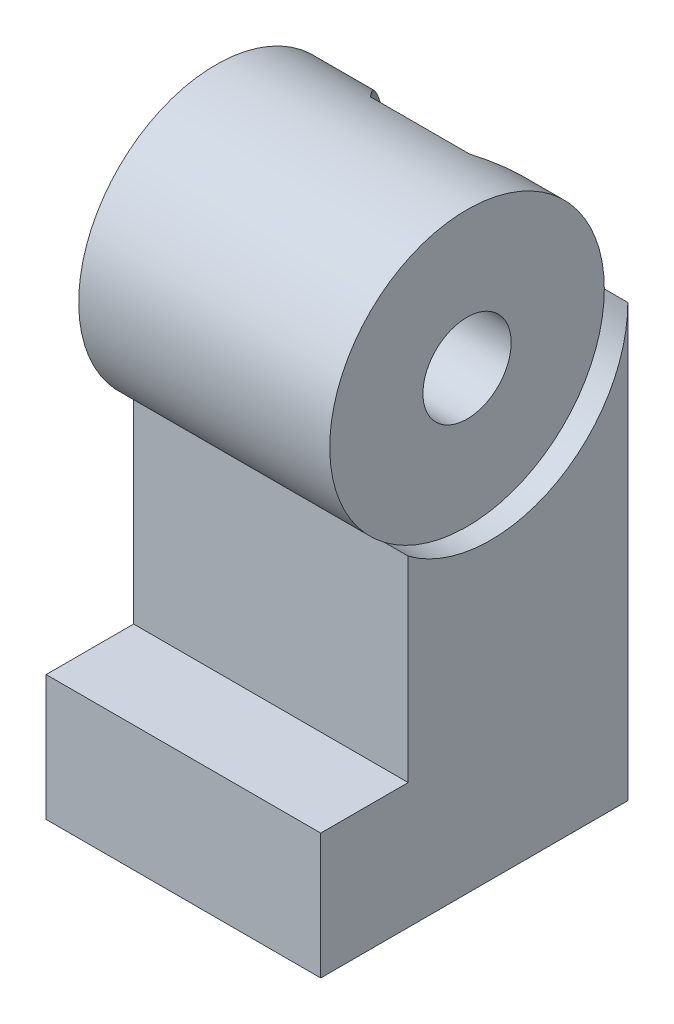
ISO-10303-21;
HEADER;
FILE_DESCRIPTION(('STEP AP214'),'2;1');
FILE_NAME('part.step','',(''),(''),'','','');
FILE_SCHEMA(('AUTOMOTIVE_DESIGN { 1 0 10303 214 1 1 1 1 }'));
ENDSEC;
DATA;
#1=APPLICATION_CONTEXT('core data for automotive mechanical design processes');
#2=APPLICATION_PROTOCOL_DEFINITION('international standard','automotive_design',2000,#1);
#3=PRODUCT_CONTEXT('',#1,'mechanical');
#4=PRODUCT('Part','Part','',(#3));
#5=PRODUCT_RELATED_PRODUCT_CATEGORY('part','',(#4));
#6=PRODUCT_DEFINITION_FORMATION('','',#4);
#7=PRODUCT_DEFINITION_CONTEXT('part definition',#1,'design');
#8=PRODUCT_DEFINITION('design','',#6,#7);
#9=PRODUCT_DEFINITION_SHAPE('','',#8);
#10=(LENGTH_UNIT() NAMED_UNIT(*) SI_UNIT(.MILLI.,.METRE.));
#11=(NAMED_UNIT(*) PLANE_ANGLE_UNIT() SI_UNIT($,.RADIAN.));
#12=(NAMED_UNIT(*) SI_UNIT($,.STERADIAN.) SOLID_ANGLE_UNIT());
#13=UNCERTAINTY_MEASURE_WITH_UNIT(LENGTH_MEASURE(1.E-05),#10,'distance_accuracy_value','');
#14=(GEOMETRIC_REPRESENTATION_CONTEXT(3) GLOBAL_UNCERTAINTY_ASSIGNED_CONTEXT((#13)) GLOBAL_UNIT_ASSIGNED_CONTEXT((#10,
#11,#12)) REPRESENTATION_CONTEXT('',''));
#15=CARTESIAN_POINT('',(0.,0.,0.));
#16=DIRECTION('',(0.,0.,1.));
#17=DIRECTION('',(1.,0.,0.));
#18=AXIS2_PLACEMENT_3D('',#15,#16,#17);
#19=CARTESIAN_POINT('',(3.5,11.9,-6.03));
#20=DIRECTION('',(0.,0.,-1.));
#21=DIRECTION('',(-1.,0.,0.));
#22=AXIS2_PLACEMENT_3D('',#19,#20,#21);
#23=PLANE('',#22);
#24=DIRECTION('',(0.,1.,0.));
#25=VECTOR('',#24,1.);
#26=CARTESIAN_POINT('',(1.34039768722099,13.1594117081557,-6.03));
#27=LINE('',#26,#25);
#28=CARTESIAN_POINT('',(1.34039768722099,10.6405882918443,-6.03));
#29=VERTEX_POINT('',#28);
#30=CARTESIAN_POINT('',(1.34039768722099,13.1594117081557,-6.03));
#31=VERTEX_POINT('',#30);
#32=EDGE_CURVE('E195',#29,#31,#27,.T.);
#33=ORIENTED_EDGE('',*,*,#32,.F.);
#34=CARTESIAN_POINT('',(3.5,11.9,-6.03));
#35=DIRECTION('',(0.,0.,-1.));
#36=DIRECTION('',(-1.,0.,0.));
#37=AXIS2_PLACEMENT_3D('',#34,#35,#36);
#38=CIRCLE('',#37,2.5);
#39=EDGE_CURVE('E275',#29,#31,#38,.T.);
#40=ORIENTED_EDGE('',*,*,#39,.T.);
#41=EDGE_LOOP('',(#33,#40));
#42=FACE_BOUND('',#41,.T.);
#43=ADVANCED_FACE('F36',(#42),#23,.T.);
#44=CARTESIAN_POINT('',(7.,11.,-4.33));
#45=DIRECTION('',(-1.,0.,0.));
#46=DIRECTION('',(0.,0.,1.));
#47=AXIS2_PLACEMENT_3D('',#44,#45,#46);
#48=CYLINDRICAL_SURFACE('',#47,3.5);
#49=DIRECTION('',(-1.,0.,0.));
#50=VECTOR('',#49,1.);
#51=CARTESIAN_POINT('',(7.,11.,-7.83));
#52=LINE('',#51,#50);
#53=CARTESIAN_POINT('',(6.4,11.,-7.83));
#54=VERTEX_POINT('',#53);
#55=CARTESIAN_POINT('',(5.83238075793812,11.,-7.83));
#56=VERTEX_POINT('',#55);
#57=EDGE_CURVE('E370',#54,#56,#52,.T.);
#58=ORIENTED_EDGE('',*,*,#57,.T.);
#59=CARTESIAN_POINT('',(5.83238075793812,11.,-7.83));
#60=CARTESIAN_POINT('',(5.85384822010717,11.0556037228795,-7.83001039992839));
#61=CARTESIAN_POINT('',(5.87330863674848,11.1119864470982,-7.82867511545479));
#62=CARTESIAN_POINT('',(5.90812719082589,11.2258673812913,-7.82316690174125));
#63=CARTESIAN_POINT('',(5.9234853733801,11.2833655789899,-7.81899400371236));
#64=CARTESIAN_POINT('',(5.94995662444864,11.398795817994,-7.80768783715019));
#65=CARTESIAN_POINT('',(5.96108707069162,11.4567250630494,-7.80056694421528));
#66=CARTESIAN_POINT('',(5.97918764646106,11.5727648991559,-7.78331566720582));
#67=CARTESIAN_POINT('',(5.98615805377609,11.6308754778378,-7.77318548414569));
#68=CARTESIAN_POINT('',(6.00089164117058,11.8048723986325,-7.73824257253206));
#69=CARTESIAN_POINT('',(6.00248352918532,11.9204521126609,-7.70887479252964));
#70=CARTESIAN_POINT('',(5.99034801857386,12.1471916349346,-7.63878917767626));
#71=CARTESIAN_POINT('',(5.97661375172738,12.2583494384298,-7.59806626030262));
#72=CARTESIAN_POINT('',(5.93513597074101,12.4769175354432,-7.50540527907961));
#73=CARTESIAN_POINT('',(5.90700505648089,12.5841312762403,-7.45318113676706));
#74=CARTESIAN_POINT('',(5.83881285104981,12.7897849945176,-7.34006344052072));
#75=CARTESIAN_POINT('',(5.79874377980076,12.8882191958614,-7.2791642466183));
#76=CARTESIAN_POINT('',(5.68488323176721,13.1254072001919,-7.11620266989741));
#77=CARTESIAN_POINT('',(5.60448659901195,13.2577904960523,-7.00946321174239));
#78=CARTESIAN_POINT('',(5.42670988395008,13.5001573524239,-6.78492408509301));
#79=CARTESIAN_POINT('',(5.32928020162339,13.6100734029028,-6.66709259247695));
#80=CARTESIAN_POINT('',(5.15331491777087,13.7778882147941,-6.46193011620579));
#81=CARTESIAN_POINT('',(5.07809431745316,13.8414219972976,-6.3762723496963));
#82=CARTESIAN_POINT('',(4.96140589793444,13.9289491749926,-6.24675438405102));
#83=CARTESIAN_POINT('',(4.92201122887144,13.9567455338021,-6.20356263672901));
#84=CARTESIAN_POINT('',(4.84187906683864,14.0098970517849,-6.11692589064731));
#85=CARTESIAN_POINT('',(4.80114161717354,14.0352522895812,-6.07348090009183));
#86=CARTESIAN_POINT('',(4.75973849456156,14.0594117081557,-6.03));
#87=B_SPLINE_CURVE_WITH_KNOTS('',3,(#59,#60,#61,#62,#63,#64,#65,#66,#67,#68,#69,#70,#71,#72,#73,
#74,#75,#76,#77,#78,#79,#80,#81,#82,#83,#84,#85,#86),.UNSPECIFIED.,.F.,.F.,(4,2,2,2,2,2,2,2,2,2,
2,2,2,4),(0.,0.17876319910252,0.357524432010829,0.535542719933676,0.713549119271721,
1.06947602744379,1.42556250378531,1.79177839089952,2.15823346432115,2.71942223368447,
3.28227325770834,3.6732563436139,3.867394978456,4.06152735843827),.UNSPECIFIED.);
#88=CARTESIAN_POINT('',(4.75973849456156,14.0594117081557,-6.03));
#89=VERTEX_POINT('',#88);
#90=EDGE_CURVE('E286',#56,#89,#87,.T.);
#91=ORIENTED_EDGE('',*,*,#90,.T.);
#92=DIRECTION('',(-1.,0.,0.));
#93=VECTOR('',#92,1.);
#94=CARTESIAN_POINT('',(7.,14.0594117081557,-6.03));
#95=LINE('',#94,#93);
#96=CARTESIAN_POINT('',(2.24026150543844,14.0594117081557,-6.03));
#97=VERTEX_POINT('',#96);
#98=EDGE_CURVE('E44',#97,#89,#95,.F.);
#99=ORIENTED_EDGE('',*,*,#98,.F.);
#100=CARTESIAN_POINT('',(2.24026150543844,14.0594117081557,-6.03));
#101=CARTESIAN_POINT('',(2.17308296360417,14.0201847934842,-6.10060872018845));
#102=CARTESIAN_POINT('',(2.10758615747843,13.9778062067549,-6.17110437893786));
#103=CARTESIAN_POINT('',(1.98009295615254,13.886475673501,-6.31122449351207));
#104=CARTESIAN_POINT('',(1.91810192473916,13.8375140219315,-6.38084749392807));
#105=CARTESIAN_POINT('',(1.79733969422032,13.7323237192715,-6.51907095077589));
#106=CARTESIAN_POINT('',(1.73860827093839,13.6760253638337,-6.58765346961922));
#107=CARTESIAN_POINT('',(1.62567243122048,13.5564001910063,-6.72226296218016));
#108=CARTESIAN_POINT('',(1.57146523558541,13.4930777449861,-6.78829149121666));
#109=CARTESIAN_POINT('',(1.44201995140707,13.3251253424091,-6.9498129946883));
#110=CARTESIAN_POINT('',(1.37008620298902,13.215851810845,-7.0432353067989));
#111=CARTESIAN_POINT('',(1.24187699940769,12.9810490235027,-7.21908778885267));
#112=CARTESIAN_POINT('',(1.18554349112858,12.8555826543195,-7.30155810113673));
#113=CARTESIAN_POINT('',(1.10128695834074,12.6137561391326,-7.43828234742055));
#114=CARTESIAN_POINT('',(1.07005384693101,12.49991962628,-7.49493864656214));
#115=CARTESIAN_POINT('',(1.02369089142462,12.263750084517,-7.59640100657131));
#116=CARTESIAN_POINT('',(1.0085606188956,12.1414172817513,-7.64120738269428));
#117=CARTESIAN_POINT('',(0.99978149854385,11.9537837363267,-7.69818210216271));
#118=CARTESIAN_POINT('',(0.999200548110506,11.8902869949017,-7.71551654467827));
#119=CARTESIAN_POINT('',(1.00296516670746,11.7625652319258,-7.74654781322381));
#120=CARTESIAN_POINT('',(1.00730835614289,11.6983405769829,-7.76024639234143));
#121=CARTESIAN_POINT('',(1.02105833292953,11.5698114935737,-7.78392315250354));
#122=CARTESIAN_POINT('',(1.03046059548942,11.5055071875433,-7.79390464460064));
#123=CARTESIAN_POINT('',(1.05436257244313,11.3774122743731,-7.81019020121197));
#124=CARTESIAN_POINT('',(1.06885938853491,11.3136213962056,-7.8164963512245));
#125=CARTESIAN_POINT('',(1.09727819094867,11.2080053885378,-7.82407239011788));
#126=CARTESIAN_POINT('',(1.10981528005078,11.1658691875481,-7.82631710407692));
#127=CARTESIAN_POINT('',(1.13708253635506,11.0823513081066,-7.82928055361981));
#128=CARTESIAN_POINT('',(1.15180824929459,11.0409682844664,-7.83000234432515));
#129=CARTESIAN_POINT('',(1.16761924206187,11.,-7.83));
#130=B_SPLINE_CURVE_WITH_KNOTS('',3,(#100,#101,#102,#103,#104,#105,#106,#107,#108,#109,#110,
#111,#112,#113,#114,#115,#116,#117,#118,#119,#120,#121,#122,#123,#124,#125,#126,#127,#128,#129),
.UNSPECIFIED.,.F.,.F.,(4,2,2,2,2,2,2,2,2,2,2,2,2,2,4),(0.,0.31515156339305,0.630772938407096,
0.949647664416303,1.26832504380493,1.74888218158112,2.2276262284512,2.61891205471194,
3.01018747015603,3.20741415078802,3.40454556206459,3.60150095306902,3.79834447665022,
3.9303197138308,4.06202994406064),.UNSPECIFIED.);
#131=CARTESIAN_POINT('',(1.16761924206188,11.,-7.83));
#132=VERTEX_POINT('',#131);
#133=EDGE_CURVE('E271',#97,#132,#130,.T.);
#134=ORIENTED_EDGE('',*,*,#133,.T.);
#135=CARTESIAN_POINT('',(0.,11.,-7.83));
#136=VERTEX_POINT('',#135);
#137=EDGE_CURVE('E371',#132,#136,#52,.T.);
#138=ORIENTED_EDGE('',*,*,#137,.T.);
#139=CARTESIAN_POINT('',(0.,11.,-4.33));
#140=DIRECTION('',(1.,0.,0.));
#141=DIRECTION('',(0.,0.,1.));
#142=AXIS2_PLACEMENT_3D('',#139,#140,#141);
#143=CIRCLE('',#142,3.5);
#144=CARTESIAN_POINT('',(0.,8.2,-2.23));
#145=VERTEX_POINT('',#144);
#146=EDGE_CURVE('E388',#136,#145,#143,.T.);
#147=ORIENTED_EDGE('',*,*,#146,.T.);
#148=DIRECTION('',(-1.,0.,0.));
#149=VECTOR('',#148,1.);
#150=CARTESIAN_POINT('',(7.,8.2,-2.23));
#151=LINE('',#150,#149);
#152=CARTESIAN_POINT('',(6.4,8.2,-2.23));
#153=VERTEX_POINT('',#152);
#154=EDGE_CURVE('E375',#153,#145,#151,.T.);
#155=ORIENTED_EDGE('',*,*,#154,.F.);
#156=CARTESIAN_POINT('',(6.4,11.,-4.33));
#157=DIRECTION('',(1.,0.,0.));
#158=DIRECTION('',(0.,0.,-1.));
#159=AXIS2_PLACEMENT_3D('',#156,#157,#158);
#160=CIRCLE('',#159,3.5);
#161=EDGE_CURVE('E399',#54,#153,#160,.T.);
#162=ORIENTED_EDGE('',*,*,#161,.F.);
#163=EDGE_LOOP('',(#58,#91,#99,#134,#138,#147,#155,#162));
#164=FACE_BOUND('',#163,.T.);
#165=ADVANCED_FACE('F292',(#164),#48,.T.);
#166=CARTESIAN_POINT('',(7.,3.2,0.));
#167=DIRECTION('',(0.,0.,-1.));
#168=DIRECTION('',(0.,1.,0.));
#169=AXIS2_PLACEMENT_3D('',#166,#167,#168);
#170=PLANE('',#169);
#171=DIRECTION('',(0.,-1.,0.));
#172=VECTOR('',#171,1.);
#173=CARTESIAN_POINT('',(0.,3.2,0.));
#174=LINE('',#173,#172);
#175=CARTESIAN_POINT('',(0.,3.2,0.));
#176=VERTEX_POINT('',#175);
#177=CARTESIAN_POINT('',(0.,0.,0.));
#178=VERTEX_POINT('',#177);
#179=EDGE_CURVE('E396',#176,#178,#174,.T.);
#180=ORIENTED_EDGE('',*,*,#179,.T.);
#181=DIRECTION('',(-1.,0.,0.));
#182=VECTOR('',#181,1.);
#183=CARTESIAN_POINT('',(7.,0.,0.));
#184=LINE('',#183,#182);
#185=CARTESIAN_POINT('',(7.,0.,0.));
#186=VERTEX_POINT('',#185);
#187=EDGE_CURVE('E360',#186,#178,#184,.T.);
#188=ORIENTED_EDGE('',*,*,#187,.F.);
#189=DIRECTION('',(0.,-1.,0.));
#190=VECTOR('',#189,1.);
#191=CARTESIAN_POINT('',(7.,3.2,0.));
#192=LINE('',#191,#190);
#193=CARTESIAN_POINT('',(7.,3.2,0.));
#194=VERTEX_POINT('',#193);
#195=EDGE_CURVE('E385',#194,#186,#192,.T.);
#196=ORIENTED_EDGE('',*,*,#195,.F.);
#197=DIRECTION('',(-1.,0.,0.));
#198=VECTOR('',#197,1.);
#199=CARTESIAN_POINT('',(7.,3.2,0.));
#200=LINE('',#199,#198);
#201=EDGE_CURVE('E379',#194,#176,#200,.T.);
#202=ORIENTED_EDGE('',*,*,#201,.T.);
#203=EDGE_LOOP('',(#180,#188,#196,#202));
#204=FACE_BOUND('',#203,.T.);
#205=ADVANCED_FACE('F38',(#204),#170,.F.);
#206=CARTESIAN_POINT('',(7.,0.,0.));
#207=DIRECTION('',(0.,1.,0.));
#208=DIRECTION('',(0.,0.,1.));
#209=AXIS2_PLACEMENT_3D('',#206,#207,#208);
#210=PLANE('',#209);
#211=DIRECTION('',(1.,0.,0.));
#212=VECTOR('',#211,1.);
#213=CARTESIAN_POINT('',(6.,0.,-6.4));
#214=LINE('',#213,#212);
#215=CARTESIAN_POINT('',(1.,0.,-6.4));
#216=VERTEX_POINT('',#215);
#217=CARTESIAN_POINT('',(6.,0.,-6.4));
#218=VERTEX_POINT('',#217);
#219=EDGE_CURVE('E252',#216,#218,#214,.T.);
#220=ORIENTED_EDGE('',*,*,#219,.F.);
#221=DIRECTION('',(0.,0.,-1.));
#222=VECTOR('',#221,1.);
#223=CARTESIAN_POINT('',(1.,0.,-6.4));
#224=LINE('',#223,#222);
#225=CARTESIAN_POINT('',(1.,0.,-1.4));
#226=VERTEX_POINT('',#225);
#227=EDGE_CURVE('E59',#226,#216,#224,.T.);
#228=ORIENTED_EDGE('',*,*,#227,.F.);
#229=DIRECTION('',(-1.,0.,0.));
#230=VECTOR('',#229,1.);
#231=CARTESIAN_POINT('',(1.,0.,-1.4));
#232=LINE('',#231,#230);
#233=CARTESIAN_POINT('',(6.,0.,-1.4));
#234=VERTEX_POINT('',#233);
#235=EDGE_CURVE('E245',#234,#226,#232,.T.);
#236=ORIENTED_EDGE('',*,*,#235,.F.);
#237=DIRECTION('',(0.,0.,1.));
#238=VECTOR('',#237,1.);
#239=CARTESIAN_POINT('',(6.,0.,-1.4));
#240=LINE('',#239,#238);
#241=EDGE_CURVE('E255',#218,#234,#240,.T.);
#242=ORIENTED_EDGE('',*,*,#241,.F.);
#243=EDGE_LOOP('',(#220,#228,#236,#242));
#244=FACE_BOUND('',#243,.T.);
#245=DIRECTION('',(0.,0.,-1.));
#246=VECTOR('',#245,1.);
#247=CARTESIAN_POINT('',(0.,0.,0.));
#248=LINE('',#247,#246);
#249=CARTESIAN_POINT('',(0.,0.,-7.83));
#250=VERTEX_POINT('',#249);
#251=EDGE_CURVE('E394',#178,#250,#248,.T.);
#252=ORIENTED_EDGE('',*,*,#251,.T.);
#253=DIRECTION('',(-1.,0.,0.));
#254=VECTOR('',#253,1.);
#255=CARTESIAN_POINT('',(7.,0.,-7.83));
#256=LINE('',#255,#254);
#257=CARTESIAN_POINT('',(7.,0.,-7.83));
#258=VERTEX_POINT('',#257);
#259=EDGE_CURVE('E365',#258,#250,#256,.T.);
#260=ORIENTED_EDGE('',*,*,#259,.F.);
#261=DIRECTION('',(0.,0.,-1.));
#262=VECTOR('',#261,1.);
#263=CARTESIAN_POINT('',(7.,0.,0.));
#264=LINE('',#263,#262);
#265=EDGE_CURVE('E406',#186,#258,#264,.T.);
#266=ORIENTED_EDGE('',*,*,#265,.F.);
#267=ORIENTED_EDGE('',*,*,#187,.T.);
#268=EDGE_LOOP('',(#252,#260,#266,#267));
#269=FACE_BOUND('',#268,.T.);
#270=ADVANCED_FACE('F336',(#244,#269),#210,.F.);
#271=CARTESIAN_POINT('',(7.,0.,-7.83));
#272=DIRECTION('',(0.,0.,1.));
#273=DIRECTION('',(1.,0.,0.));
#274=AXIS2_PLACEMENT_3D('',#271,#272,#273);
#275=PLANE('',#274);
#276=CARTESIAN_POINT('',(3.5,3.9,-7.83));
#277=DIRECTION('',(0.,0.,-1.));
#278=DIRECTION('',(-1.,0.,0.));
#279=AXIS2_PLACEMENT_3D('',#276,#277,#278);
#280=CIRCLE('',#279,2.5);
#281=CARTESIAN_POINT('',(0.999999999999999,3.9,-7.83));
#282=VERTEX_POINT('',#281);
#283=EDGE_CURVE('E268',#282,#282,#280,.T.);
#284=ORIENTED_EDGE('',*,*,#283,.F.);
#285=EDGE_LOOP('',(#284));
#286=FACE_BOUND('',#285,.T.);
#287=ORIENTED_EDGE('',*,*,#137,.F.);
#288=CARTESIAN_POINT('',(3.5,11.9,-7.83));
#289=DIRECTION('',(0.,0.,-1.));
#290=DIRECTION('',(-1.,0.,0.));
#291=AXIS2_PLACEMENT_3D('',#288,#289,#290);
#292=CIRCLE('',#291,2.5);
#293=EDGE_CURVE('E261',#56,#132,#292,.T.);
#294=ORIENTED_EDGE('',*,*,#293,.F.);
#295=ORIENTED_EDGE('',*,*,#57,.F.);
#296=CARTESIAN_POINT('',(7.,11.,-7.83));
#297=VERTEX_POINT('',#296);
#298=EDGE_CURVE('E368',#297,#54,#52,.T.);
#299=ORIENTED_EDGE('',*,*,#298,.F.);
#300=DIRECTION('',(0.,1.,0.));
#301=VECTOR('',#300,1.);
#302=CARTESIAN_POINT('',(7.,0.,-7.83));
#303=LINE('',#302,#301);
#304=EDGE_CURVE('E403',#258,#297,#303,.T.);
#305=ORIENTED_EDGE('',*,*,#304,.F.);
#306=ORIENTED_EDGE('',*,*,#259,.T.);
#307=DIRECTION('',(0.,1.,0.));
#308=VECTOR('',#307,1.);
#309=CARTESIAN_POINT('',(0.,0.,-7.83));
#310=LINE('',#309,#308);
#311=EDGE_CURVE('E391',#250,#136,#310,.T.);
#312=ORIENTED_EDGE('',*,*,#311,.T.);
#313=EDGE_LOOP('',(#287,#294,#295,#299,#305,#306,#312));
#314=FACE_BOUND('',#313,.T.);
#315=ADVANCED_FACE('F331',(#286,#314),#275,.F.);
#316=CARTESIAN_POINT('',(7.,3.2,-2.23));
#317=DIRECTION('',(0.,0.,-1.));
#318=DIRECTION('',(-1.,0.,0.));
#319=AXIS2_PLACEMENT_3D('',#316,#317,#318);
#320=PLANE('',#319);
#321=DIRECTION('',(0.,-1.,0.));
#322=VECTOR('',#321,1.);
#323=CARTESIAN_POINT('',(0.,3.2,-2.23));
#324=LINE('',#323,#322);
#325=CARTESIAN_POINT('',(0.,3.2,-2.23));
#326=VERTEX_POINT('',#325);
#327=EDGE_CURVE('E386',#145,#326,#324,.T.);
#328=ORIENTED_EDGE('',*,*,#327,.T.);
#329=DIRECTION('',(-1.,0.,0.));
#330=VECTOR('',#329,1.);
#331=CARTESIAN_POINT('',(7.,3.2,-2.23));
#332=LINE('',#331,#330);
#333=CARTESIAN_POINT('',(7.,3.2,-2.23));
#334=VERTEX_POINT('',#333);
#335=EDGE_CURVE('E376',#334,#326,#332,.T.);
#336=ORIENTED_EDGE('',*,*,#335,.F.);
#337=DIRECTION('',(0.,-1.,0.));
#338=VECTOR('',#337,1.);
#339=CARTESIAN_POINT('',(7.,3.2,-2.23));
#340=LINE('',#339,#338);
#341=CARTESIAN_POINT('',(7.,8.2,-2.23));
#342=VERTEX_POINT('',#341);
#343=EDGE_CURVE('E401',#342,#334,#340,.T.);
#344=ORIENTED_EDGE('',*,*,#343,.F.);
#345=EDGE_CURVE('E372',#342,#153,#151,.T.);
#346=ORIENTED_EDGE('',*,*,#345,.T.);
#347=ORIENTED_EDGE('',*,*,#154,.T.);
#348=EDGE_LOOP('',(#328,#336,#344,#346,#347));
#349=FACE_BOUND('',#348,.T.);
#350=ADVANCED_FACE('F328',(#349),#320,.F.);
#351=CARTESIAN_POINT('',(7.,3.2,-2.23));
#352=DIRECTION('',(0.,-1.,0.));
#353=DIRECTION('',(0.,0.,-1.));
#354=AXIS2_PLACEMENT_3D('',#351,#352,#353);
#355=PLANE('',#354);
#356=DIRECTION('',(0.,0.,1.));
#357=VECTOR('',#356,1.);
#358=CARTESIAN_POINT('',(0.,3.2,-2.23));
#359=LINE('',#358,#357);
#360=EDGE_CURVE('E383',#326,#176,#359,.T.);
#361=ORIENTED_EDGE('',*,*,#360,.T.);
#362=ORIENTED_EDGE('',*,*,#201,.F.);
#363=DIRECTION('',(0.,0.,1.));
#364=VECTOR('',#363,1.);
#365=CARTESIAN_POINT('',(7.,3.2,-2.23));
#366=LINE('',#365,#364);
#367=EDGE_CURVE('E382',#334,#194,#366,.T.);
#368=ORIENTED_EDGE('',*,*,#367,.F.);
#369=ORIENTED_EDGE('',*,*,#335,.T.);
#370=EDGE_LOOP('',(#361,#362,#368,#369));
#371=FACE_BOUND('',#370,.T.);
#372=ADVANCED_FACE('F322',(#371),#355,.F.);
#373=CARTESIAN_POINT('',(7.,11.,-4.33));
#374=DIRECTION('',(-1.,0.,0.));
#375=DIRECTION('',(0.,0.,1.));
#376=AXIS2_PLACEMENT_3D('',#373,#374,#375);
#377=PLANE('',#376);
#378=ORIENTED_EDGE('',*,*,#304,.T.);
#379=CARTESIAN_POINT('',(7.,11.,-4.33));
#380=DIRECTION('',(-1.,0.,0.));
#381=DIRECTION('',(0.,0.,1.));
#382=AXIS2_PLACEMENT_3D('',#379,#380,#381);
#383=CIRCLE('',#382,3.5);
#384=EDGE_CURVE('E358',#297,#342,#383,.T.);
#385=ORIENTED_EDGE('',*,*,#384,.T.);
#386=ORIENTED_EDGE('',*,*,#343,.T.);
#387=ORIENTED_EDGE('',*,*,#367,.T.);
#388=ORIENTED_EDGE('',*,*,#195,.T.);
#389=ORIENTED_EDGE('',*,*,#265,.T.);
#390=EDGE_LOOP('',(#378,#385,#386,#387,#388,#389));
#391=FACE_BOUND('',#390,.T.);
#392=ADVANCED_FACE('F319',(#391),#377,.F.);
#393=CARTESIAN_POINT('',(0.,11.,-4.33));
#394=DIRECTION('',(-1.,0.,0.));
#395=DIRECTION('',(0.,0.,1.));
#396=AXIS2_PLACEMENT_3D('',#393,#394,#395);
#397=PLANE('',#396);
#398=ORIENTED_EDGE('',*,*,#179,.F.);
#399=ORIENTED_EDGE('',*,*,#360,.F.);
#400=ORIENTED_EDGE('',*,*,#327,.F.);
#401=ORIENTED_EDGE('',*,*,#146,.F.);
#402=ORIENTED_EDGE('',*,*,#311,.F.);
#403=ORIENTED_EDGE('',*,*,#251,.F.);
#404=EDGE_LOOP('',(#398,#399,#400,#401,#402,#403));
#405=FACE_BOUND('',#404,.T.);
#406=ADVANCED_FACE('F317',(#405),#397,.T.);
#407=CARTESIAN_POINT('',(6.4,11.,-4.33));
#408=DIRECTION('',(1.,0.,0.));
#409=DIRECTION('',(0.,0.,-1.));
#410=AXIS2_PLACEMENT_3D('',#407,#408,#409);
#411=CYLINDRICAL_SURFACE('',#410,3.5);
#412=EDGE_CURVE('E411',#153,#54,#160,.T.);
#413=ORIENTED_EDGE('',*,*,#412,.F.);
#414=ORIENTED_EDGE('',*,*,#345,.F.);
#415=ORIENTED_EDGE('',*,*,#384,.F.);
#416=ORIENTED_EDGE('',*,*,#298,.T.);
#417=EDGE_LOOP('',(#413,#414,#415,#416));
#418=FACE_BOUND('',#417,.T.);
#419=ADVANCED_FACE('F313',(#418),#411,.F.);
#420=CARTESIAN_POINT('',(6.4,11.,-4.33));
#421=DIRECTION('',(1.,0.,0.));
#422=DIRECTION('',(0.,0.,-1.));
#423=AXIS2_PLACEMENT_3D('',#420,#421,#422);
#424=PLANE('',#423);
#425=CARTESIAN_POINT('',(6.4,11.,-4.33));
#426=DIRECTION('',(1.,0.,0.));
#427=DIRECTION('',(0.,0.,-1.));
#428=AXIS2_PLACEMENT_3D('',#425,#426,#427);
#429=CIRCLE('',#428,1.125);
#430=CARTESIAN_POINT('',(6.4,11.,-5.455));
#431=VERTEX_POINT('',#430);
#432=EDGE_CURVE('E412',#431,#431,#429,.T.);
#433=ORIENTED_EDGE('',*,*,#432,.F.);
#434=EDGE_LOOP('',(#433));
#435=FACE_BOUND('',#434,.T.);
#436=ORIENTED_EDGE('',*,*,#161,.T.);
#437=ORIENTED_EDGE('',*,*,#412,.T.);
#438=EDGE_LOOP('',(#436,#437));
#439=FACE_BOUND('',#438,.T.);
#440=ADVANCED_FACE('F309',(#435,#439),#424,.T.);
#441=CARTESIAN_POINT('',(2.4,11.,-4.33));
#442=DIRECTION('',(1.,0.,0.));
#443=DIRECTION('',(0.,0.,-1.));
#444=AXIS2_PLACEMENT_3D('',#441,#442,#443);
#445=CYLINDRICAL_SURFACE('',#444,1.125);
#446=CARTESIAN_POINT('',(4.4,11.,-4.33));
#447=DIRECTION('',(1.,0.,0.));
#448=DIRECTION('',(0.,1.,0.));
#449=AXIS2_PLACEMENT_3D('',#446,#447,#448);
#450=CIRCLE('',#449,1.125);
#451=CARTESIAN_POINT('',(4.4,12.125,-4.33));
#452=VERTEX_POINT('',#451);
#453=EDGE_CURVE('E206',#452,#452,#450,.F.);
#454=ORIENTED_EDGE('',*,*,#453,.T.);
#455=EDGE_LOOP('',(#454));
#456=FACE_BOUND('',#455,.T.);
#457=ORIENTED_EDGE('',*,*,#432,.T.);
#458=EDGE_LOOP('',(#457));
#459=FACE_BOUND('',#458,.T.);
#460=ADVANCED_FACE('F305',(#456,#459),#445,.F.);
#461=DIRECTION('',(1.,0.,0.));
#462=VECTOR('',#461,1.);
#463=CARTESIAN_POINT('',(4.4,13.1594117081557,-6.03));
#464=LINE('',#463,#462);
#465=CARTESIAN_POINT('',(4.4,13.1594117081557,-6.03));
#466=VERTEX_POINT('',#465);
#467=EDGE_CURVE('E180',#31,#466,#464,.T.);
#468=ORIENTED_EDGE('',*,*,#467,.F.);
#469=EDGE_CURVE('E276',#31,#97,#38,.T.);
#470=ORIENTED_EDGE('',*,*,#469,.T.);
#471=ORIENTED_EDGE('',*,*,#98,.T.);
#472=CARTESIAN_POINT('',(4.4,9.56761924206188,-6.03));
#473=VERTEX_POINT('',#472);
#474=EDGE_CURVE('E272',#89,#473,#38,.T.);
#475=ORIENTED_EDGE('',*,*,#474,.T.);
#476=DIRECTION('',(0.,-1.,0.));
#477=VECTOR('',#476,1.);
#478=CARTESIAN_POINT('',(4.4,13.1594117081557,-6.03));
#479=LINE('',#478,#477);
#480=EDGE_CURVE('E51',#466,#473,#479,.T.);
#481=ORIENTED_EDGE('',*,*,#480,.F.);
#482=EDGE_LOOP('',(#468,#470,#471,#475,#481));
#483=FACE_BOUND('',#482,.T.);
#484=ADVANCED_FACE('F302',(#483),#23,.T.);
#485=CARTESIAN_POINT('',(3.5,11.9,-6.03));
#486=DIRECTION('',(0.,0.,-1.));
#487=DIRECTION('',(-1.,0.,0.));
#488=AXIS2_PLACEMENT_3D('',#485,#486,#487);
#489=CYLINDRICAL_SURFACE('',#488,2.5);
#490=ORIENTED_EDGE('',*,*,#293,.T.);
#491=ORIENTED_EDGE('',*,*,#133,.F.);
#492=ORIENTED_EDGE('',*,*,#469,.F.);
#493=ORIENTED_EDGE('',*,*,#39,.F.);
#494=DIRECTION('',(0.,0.,-1.));
#495=VECTOR('',#494,1.);
#496=CARTESIAN_POINT('',(1.34039768722099,10.6405882918443,-3.03));
#497=LINE('',#496,#495);
#498=CARTESIAN_POINT('',(1.34039768722099,10.6405882918443,-3.03));
#499=VERTEX_POINT('',#498);
#500=EDGE_CURVE('E207',#499,#29,#497,.T.);
#501=ORIENTED_EDGE('',*,*,#500,.F.);
#502=CARTESIAN_POINT('',(3.5,11.9,-3.03));
#503=DIRECTION('',(0.,0.,-1.));
#504=DIRECTION('',(1.,0.,0.));
#505=AXIS2_PLACEMENT_3D('',#502,#503,#504);
#506=CIRCLE('',#505,2.50000000000001);
#507=CARTESIAN_POINT('',(4.4,9.56761924206188,-3.03));
#508=VERTEX_POINT('',#507);
#509=EDGE_CURVE('E191',#508,#499,#506,.T.);
#510=ORIENTED_EDGE('',*,*,#509,.F.);
#511=DIRECTION('',(0.,0.,-1.));
#512=VECTOR('',#511,1.);
#513=CARTESIAN_POINT('',(4.4,9.56761924206188,-3.03));
#514=LINE('',#513,#512);
#515=EDGE_CURVE('E181',#508,#473,#514,.T.);
#516=ORIENTED_EDGE('',*,*,#515,.T.);
#517=ORIENTED_EDGE('',*,*,#474,.F.);
#518=ORIENTED_EDGE('',*,*,#90,.F.);
#519=EDGE_LOOP('',(#490,#491,#492,#493,#501,#510,#516,#517,#518));
#520=FACE_BOUND('',#519,.T.);
#521=ADVANCED_FACE('F296',(#520),#489,.F.);
#522=CARTESIAN_POINT('',(3.5,3.9,-6.03));
#523=DIRECTION('',(0.,0.,-1.));
#524=DIRECTION('',(-1.,0.,0.));
#525=AXIS2_PLACEMENT_3D('',#522,#523,#524);
#526=CYLINDRICAL_SURFACE('',#525,2.5);
#527=CARTESIAN_POINT('',(3.5,3.9,-6.4));
#528=DIRECTION('',(0.,0.,-1.));
#529=DIRECTION('',(-1.,0.,0.));
#530=AXIS2_PLACEMENT_3D('',#527,#528,#529);
#531=CIRCLE('',#530,2.5);
#532=CARTESIAN_POINT('',(6.,3.9,-6.4));
#533=VERTEX_POINT('',#532);
#534=CARTESIAN_POINT('',(1.,3.9,-6.4));
#535=VERTEX_POINT('',#534);
#536=EDGE_CURVE('E228',#533,#535,#531,.F.);
#537=ORIENTED_EDGE('',*,*,#536,.T.);
#538=CARTESIAN_POINT('',(3.5,3.9,-6.4));
#539=DIRECTION('',(0.,0.,-1.));
#540=DIRECTION('',(-1.,0.,0.));
#541=AXIS2_PLACEMENT_3D('',#538,#539,#540);
#542=CIRCLE('',#541,2.5);
#543=EDGE_CURVE('E11',#535,#533,#542,.F.);
#544=ORIENTED_EDGE('',*,*,#543,.T.);
#545=EDGE_LOOP('',(#537,#544));
#546=FACE_BOUND('',#545,.T.);
#547=ORIENTED_EDGE('',*,*,#283,.T.);
#548=EDGE_LOOP('',(#547));
#549=FACE_BOUND('',#548,.T.);
#550=ADVANCED_FACE('F301',(#546,#549),#526,.F.);
#551=CARTESIAN_POINT('',(6.,2.2,-6.4));
#552=DIRECTION('',(0.,0.,-1.));
#553=DIRECTION('',(-1.,0.,0.));
#554=AXIS2_PLACEMENT_3D('',#551,#552,#553);
#555=PLANE('',#554);
#556=ORIENTED_EDGE('',*,*,#543,.F.);
#557=DIRECTION('',(0.,-1.,0.));
#558=VECTOR('',#557,1.);
#559=CARTESIAN_POINT('',(1.,2.2,-6.4));
#560=LINE('',#559,#558);
#561=EDGE_CURVE('E250',#535,#216,#560,.T.);
#562=ORIENTED_EDGE('',*,*,#561,.T.);
#563=ORIENTED_EDGE('',*,*,#219,.T.);
#564=DIRECTION('',(0.,-1.,0.));
#565=VECTOR('',#564,1.);
#566=CARTESIAN_POINT('',(6.,2.2,-6.4));
#567=LINE('',#566,#565);
#568=EDGE_CURVE('E265',#533,#218,#567,.T.);
#569=ORIENTED_EDGE('',*,*,#568,.F.);
#570=EDGE_LOOP('',(#556,#562,#563,#569));
#571=FACE_BOUND('',#570,.T.);
#572=ADVANCED_FACE('F453',(#571),#555,.F.);
#573=CARTESIAN_POINT('',(0.,2.2,0.));
#574=DIRECTION('',(0.,1.,0.));
#575=DIRECTION('',(0.,0.,1.));
#576=AXIS2_PLACEMENT_3D('',#573,#574,#575);
#577=PLANE('',#576);
#578=DIRECTION('',(0.,0.,-1.));
#579=VECTOR('',#578,1.);
#580=CARTESIAN_POINT('',(1.,2.2,-6.4));
#581=LINE('',#580,#579);
#582=CARTESIAN_POINT('',(1.,2.2,-1.4));
#583=VERTEX_POINT('',#582);
#584=CARTESIAN_POINT('',(1.,2.2,-3.1));
#585=VERTEX_POINT('',#584);
#586=EDGE_CURVE('E241',#583,#585,#581,.T.);
#587=ORIENTED_EDGE('',*,*,#586,.T.);
#588=DIRECTION('',(1.,0.,0.));
#589=VECTOR('',#588,1.);
#590=CARTESIAN_POINT('',(0.,2.2,-3.1));
#591=LINE('',#590,#589);
#592=CARTESIAN_POINT('',(6.,2.2,-3.1));
#593=VERTEX_POINT('',#592);
#594=EDGE_CURVE('E238',#585,#593,#591,.T.);
#595=ORIENTED_EDGE('',*,*,#594,.T.);
#596=DIRECTION('',(0.,0.,1.));
#597=VECTOR('',#596,1.);
#598=CARTESIAN_POINT('',(6.,2.2,-1.4));
#599=LINE('',#598,#597);
#600=CARTESIAN_POINT('',(6.,2.2,-1.4));
#601=VERTEX_POINT('',#600);
#602=EDGE_CURVE('E244',#593,#601,#599,.T.);
#603=ORIENTED_EDGE('',*,*,#602,.T.);
#604=DIRECTION('',(-1.,0.,0.));
#605=VECTOR('',#604,1.);
#606=CARTESIAN_POINT('',(1.,2.2,-1.4));
#607=LINE('',#606,#605);
#608=EDGE_CURVE('E247',#601,#583,#607,.T.);
#609=ORIENTED_EDGE('',*,*,#608,.T.);
#610=EDGE_LOOP('',(#587,#595,#603,#609));
#611=FACE_BOUND('',#610,.T.);
#612=ADVANCED_FACE('F467',(#611),#577,.F.);
#613=CARTESIAN_POINT('',(1.,2.2,-6.4));
#614=DIRECTION('',(-1.,0.,0.));
#615=DIRECTION('',(0.,0.,1.));
#616=AXIS2_PLACEMENT_3D('',#613,#614,#615);
#617=PLANE('',#616);
#618=ORIENTED_EDGE('',*,*,#227,.T.);
#619=ORIENTED_EDGE('',*,*,#561,.F.);
#620=DIRECTION('',(0.,-1.,0.));
#621=VECTOR('',#620,1.);
#622=CARTESIAN_POINT('',(1.,9.,-6.4));
#623=LINE('',#622,#621);
#624=CARTESIAN_POINT('',(1.,9.,-6.4));
#625=VERTEX_POINT('',#624);
#626=EDGE_CURVE('E224',#625,#535,#623,.T.);
#627=ORIENTED_EDGE('',*,*,#626,.F.);
#628=DIRECTION('',(0.,0.,-1.));
#629=VECTOR('',#628,1.);
#630=CARTESIAN_POINT('',(1.,9.,-6.4));
#631=LINE('',#630,#629);
#632=CARTESIAN_POINT('',(1.,9.,-3.1));
#633=VERTEX_POINT('',#632);
#634=EDGE_CURVE('E212',#633,#625,#631,.T.);
#635=ORIENTED_EDGE('',*,*,#634,.F.);
#636=DIRECTION('',(0.,-1.,0.));
#637=VECTOR('',#636,1.);
#638=CARTESIAN_POINT('',(1.,9.,-3.1));
#639=LINE('',#638,#637);
#640=EDGE_CURVE('E225',#633,#585,#639,.T.);
#641=ORIENTED_EDGE('',*,*,#640,.T.);
#642=ORIENTED_EDGE('',*,*,#586,.F.);
#643=DIRECTION('',(0.,-1.,0.));
#644=VECTOR('',#643,1.);
#645=CARTESIAN_POINT('',(1.,2.2,-1.4));
#646=LINE('',#645,#644);
#647=EDGE_CURVE('E259',#583,#226,#646,.T.);
#648=ORIENTED_EDGE('',*,*,#647,.T.);
#649=EDGE_LOOP('',(#618,#619,#627,#635,#641,#642,#648));
#650=FACE_BOUND('',#649,.T.);
#651=ADVANCED_FACE('F455',(#650),#617,.F.);
#652=CARTESIAN_POINT('',(1.,2.2,-1.4));
#653=DIRECTION('',(0.,0.,1.));
#654=DIRECTION('',(1.,0.,0.));
#655=AXIS2_PLACEMENT_3D('',#652,#653,#654);
#656=PLANE('',#655);
#657=ORIENTED_EDGE('',*,*,#235,.T.);
#658=ORIENTED_EDGE('',*,*,#647,.F.);
#659=ORIENTED_EDGE('',*,*,#608,.F.);
#660=DIRECTION('',(0.,-1.,0.));
#661=VECTOR('',#660,1.);
#662=CARTESIAN_POINT('',(6.,2.2,-1.4));
#663=LINE('',#662,#661);
#664=EDGE_CURVE('E262',#601,#234,#663,.T.);
#665=ORIENTED_EDGE('',*,*,#664,.T.);
#666=EDGE_LOOP('',(#657,#658,#659,#665));
#667=FACE_BOUND('',#666,.T.);
#668=ADVANCED_FACE('F471',(#667),#656,.F.);
#669=CARTESIAN_POINT('',(6.,2.2,-1.4));
#670=DIRECTION('',(1.,0.,0.));
#671=DIRECTION('',(0.,0.,-1.));
#672=AXIS2_PLACEMENT_3D('',#669,#670,#671);
#673=PLANE('',#672);
#674=ORIENTED_EDGE('',*,*,#602,.F.);
#675=DIRECTION('',(0.,-1.,0.));
#676=VECTOR('',#675,1.);
#677=CARTESIAN_POINT('',(6.,9.,-3.1));
#678=LINE('',#677,#676);
#679=CARTESIAN_POINT('',(6.,9.,-3.1));
#680=VERTEX_POINT('',#679);
#681=EDGE_CURVE('E229',#680,#593,#678,.T.);
#682=ORIENTED_EDGE('',*,*,#681,.F.);
#683=DIRECTION('',(0.,0.,1.));
#684=VECTOR('',#683,1.);
#685=CARTESIAN_POINT('',(6.,9.,-3.1));
#686=LINE('',#685,#684);
#687=CARTESIAN_POINT('',(6.,9.,-6.4));
#688=VERTEX_POINT('',#687);
#689=EDGE_CURVE('E218',#688,#680,#686,.T.);
#690=ORIENTED_EDGE('',*,*,#689,.F.);
#691=DIRECTION('',(0.,-1.,0.));
#692=VECTOR('',#691,1.);
#693=CARTESIAN_POINT('',(6.,9.,-6.4));
#694=LINE('',#693,#692);
#695=EDGE_CURVE('E231',#688,#533,#694,.T.);
#696=ORIENTED_EDGE('',*,*,#695,.T.);
#697=ORIENTED_EDGE('',*,*,#568,.T.);
#698=ORIENTED_EDGE('',*,*,#241,.T.);
#699=ORIENTED_EDGE('',*,*,#664,.F.);
#700=EDGE_LOOP('',(#674,#682,#690,#696,#697,#698,#699));
#701=FACE_BOUND('',#700,.T.);
#702=ADVANCED_FACE('F473',(#701),#673,.F.);
#703=CARTESIAN_POINT('',(1.,9.,-3.1));
#704=DIRECTION('',(0.,0.,1.));
#705=DIRECTION('',(1.,0.,0.));
#706=AXIS2_PLACEMENT_3D('',#703,#704,#705);
#707=PLANE('',#706);
#708=ORIENTED_EDGE('',*,*,#640,.F.);
#709=DIRECTION('',(-1.,0.,0.));
#710=VECTOR('',#709,1.);
#711=CARTESIAN_POINT('',(1.,9.,-3.1));
#712=LINE('',#711,#710);
#713=EDGE_CURVE('E221',#680,#633,#712,.T.);
#714=ORIENTED_EDGE('',*,*,#713,.F.);
#715=ORIENTED_EDGE('',*,*,#681,.T.);
#716=ORIENTED_EDGE('',*,*,#594,.F.);
#717=EDGE_LOOP('',(#708,#714,#715,#716));
#718=FACE_BOUND('',#717,.T.);
#719=ADVANCED_FACE('F476',(#718),#707,.F.);
#720=CARTESIAN_POINT('',(6.,9.,-6.4));
#721=DIRECTION('',(0.,0.,-1.));
#722=DIRECTION('',(-1.,0.,0.));
#723=AXIS2_PLACEMENT_3D('',#720,#721,#722);
#724=PLANE('',#723);
#725=ORIENTED_EDGE('',*,*,#695,.F.);
#726=DIRECTION('',(1.,0.,0.));
#727=VECTOR('',#726,1.);
#728=CARTESIAN_POINT('',(6.,9.,-6.4));
#729=LINE('',#728,#727);
#730=EDGE_CURVE('E215',#625,#688,#729,.T.);
#731=ORIENTED_EDGE('',*,*,#730,.F.);
#732=ORIENTED_EDGE('',*,*,#626,.T.);
#733=ORIENTED_EDGE('',*,*,#536,.F.);
#734=EDGE_LOOP('',(#725,#731,#732,#733));
#735=FACE_BOUND('',#734,.T.);
#736=ADVANCED_FACE('F459',(#735),#724,.F.);
#737=CARTESIAN_POINT('',(0.,9.,0.));
#738=DIRECTION('',(0.,1.,0.));
#739=DIRECTION('',(0.,0.,1.));
#740=AXIS2_PLACEMENT_3D('',#737,#738,#739);
#741=PLANE('',#740);
#742=ORIENTED_EDGE('',*,*,#634,.T.);
#743=ORIENTED_EDGE('',*,*,#730,.T.);
#744=ORIENTED_EDGE('',*,*,#689,.T.);
#745=ORIENTED_EDGE('',*,*,#713,.T.);
#746=EDGE_LOOP('',(#742,#743,#744,#745));
#747=FACE_BOUND('',#746,.T.);
#748=ADVANCED_FACE('F486',(#747),#741,.F.);
#749=CARTESIAN_POINT('',(4.4,13.1594117081557,-3.03));
#750=DIRECTION('',(1.,0.,0.));
#751=DIRECTION('',(0.,1.,0.));
#752=AXIS2_PLACEMENT_3D('',#749,#750,#751);
#753=PLANE('',#752);
#754=ORIENTED_EDGE('',*,*,#480,.T.);
#755=ORIENTED_EDGE('',*,*,#515,.F.);
#756=DIRECTION('',(0.,-1.,0.));
#757=VECTOR('',#756,1.);
#758=CARTESIAN_POINT('',(4.4,13.1594117081557,-3.03));
#759=LINE('',#758,#757);
#760=CARTESIAN_POINT('',(4.4,13.1594117081557,-3.03));
#761=VERTEX_POINT('',#760);
#762=EDGE_CURVE('E185',#761,#508,#759,.T.);
#763=ORIENTED_EDGE('',*,*,#762,.F.);
#764=DIRECTION('',(0.,0.,-1.));
#765=VECTOR('',#764,1.);
#766=CARTESIAN_POINT('',(4.4,13.1594117081557,-3.03));
#767=LINE('',#766,#765);
#768=EDGE_CURVE('E173',#761,#466,#767,.T.);
#769=ORIENTED_EDGE('',*,*,#768,.T.);
#770=EDGE_LOOP('',(#754,#755,#763,#769));
#771=FACE_BOUND('',#770,.T.);
#772=ORIENTED_EDGE('',*,*,#453,.F.);
#773=EDGE_LOOP('',(#772));
#774=FACE_BOUND('',#773,.T.);
#775=ADVANCED_FACE('F186',(#771,#774),#753,.F.);
#776=CARTESIAN_POINT('',(4.4,13.1594117081557,-3.03));
#777=DIRECTION('',(0.,1.,0.));
#778=DIRECTION('',(0.,0.,1.));
#779=AXIS2_PLACEMENT_3D('',#776,#777,#778);
#780=PLANE('',#779);
#781=ORIENTED_EDGE('',*,*,#467,.T.);
#782=ORIENTED_EDGE('',*,*,#768,.F.);
#783=DIRECTION('',(1.,0.,0.));
#784=VECTOR('',#783,1.);
#785=CARTESIAN_POINT('',(4.4,13.1594117081557,-3.03));
#786=LINE('',#785,#784);
#787=CARTESIAN_POINT('',(1.34039768722099,13.1594117081557,-3.03));
#788=VERTEX_POINT('',#787);
#789=EDGE_CURVE('E177',#788,#761,#786,.T.);
#790=ORIENTED_EDGE('',*,*,#789,.F.);
#791=DIRECTION('',(0.,0.,-1.));
#792=VECTOR('',#791,1.);
#793=CARTESIAN_POINT('',(1.34039768722099,13.1594117081557,-3.03));
#794=LINE('',#793,#792);
#795=EDGE_CURVE('E204',#788,#31,#794,.T.);
#796=ORIENTED_EDGE('',*,*,#795,.T.);
#797=EDGE_LOOP('',(#781,#782,#790,#796));
#798=FACE_BOUND('',#797,.T.);
#799=ADVANCED_FACE('F175',(#798),#780,.F.);
#800=CARTESIAN_POINT('',(1.34039768722099,13.1594117081557,-3.03));
#801=DIRECTION('',(-1.,0.,0.));
#802=DIRECTION('',(0.,0.,1.));
#803=AXIS2_PLACEMENT_3D('',#800,#801,#802);
#804=PLANE('',#803);
#805=ORIENTED_EDGE('',*,*,#32,.T.);
#806=ORIENTED_EDGE('',*,*,#795,.F.);
#807=DIRECTION('',(0.,1.,0.));
#808=VECTOR('',#807,1.);
#809=CARTESIAN_POINT('',(1.34039768722099,13.1594117081557,-3.03));
#810=LINE('',#809,#808);
#811=EDGE_CURVE('E182',#499,#788,#810,.T.);
#812=ORIENTED_EDGE('',*,*,#811,.F.);
#813=ORIENTED_EDGE('',*,*,#500,.T.);
#814=EDGE_LOOP('',(#805,#806,#812,#813));
#815=FACE_BOUND('',#814,.T.);
#816=ADVANCED_FACE('F355',(#815),#804,.F.);
#817=CARTESIAN_POINT('',(3.5,11.9,-3.03));
#818=DIRECTION('',(0.,0.,1.));
#819=DIRECTION('',(1.,0.,0.));
#820=AXIS2_PLACEMENT_3D('',#817,#818,#819);
#821=PLANE('',#820);
#822=ORIENTED_EDGE('',*,*,#789,.T.);
#823=ORIENTED_EDGE('',*,*,#762,.T.);
#824=ORIENTED_EDGE('',*,*,#509,.T.);
#825=ORIENTED_EDGE('',*,*,#811,.T.);
#826=EDGE_LOOP('',(#822,#823,#824,#825));
#827=FACE_BOUND('',#826,.T.);
#828=ADVANCED_FACE('F193',(#827),#821,.F.);
#829=CLOSED_SHELL('',(#43,#165,#205,#270,#315,#350,#372,#392,#406,#419,#440,#460,#484,#521,#550,
#572,#612,#651,#668,#702,#719,#736,#748,#775,#799,#816,#828));
#830=MANIFOLD_SOLID_BREP('B2',#829);
#831=ADVANCED_BREP_SHAPE_REPRESENTATION('',(#18,#830),#14);
#832=SHAPE_DEFINITION_REPRESENTATION(#9,#831);
ENDSEC;
END-ISO-10303-21;
